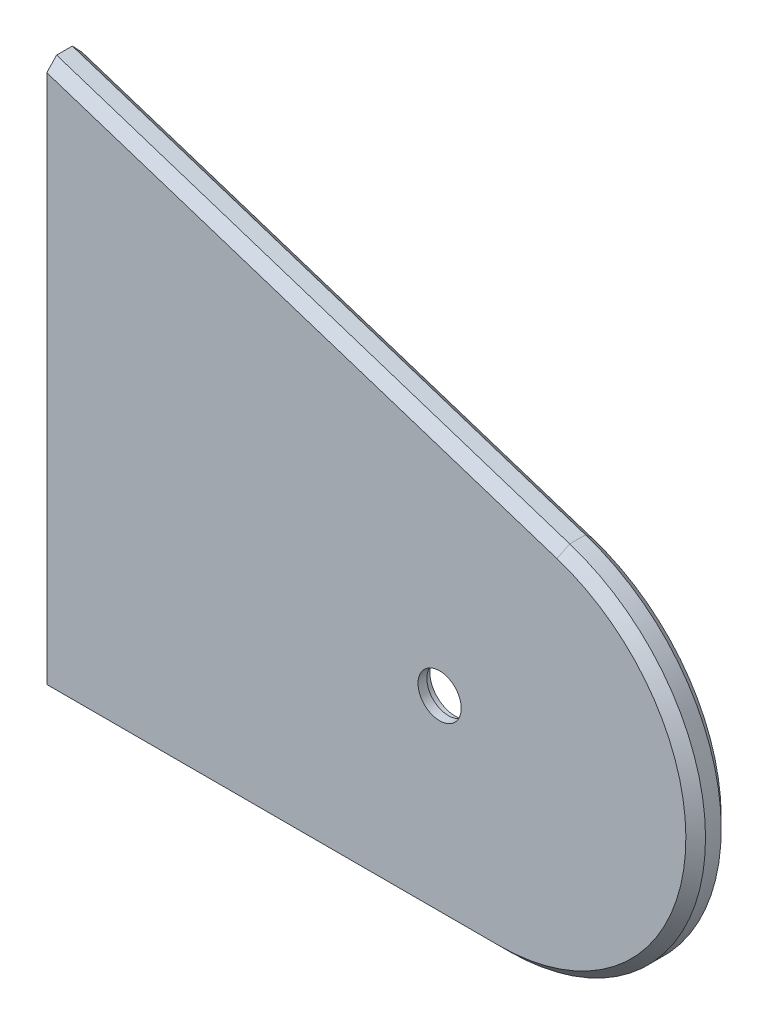
ISO-10303-21;
HEADER;
FILE_DESCRIPTION(('STEP AP214'),'2;1');
FILE_NAME('part.step','',(''),(''),'','','');
FILE_SCHEMA(('AUTOMOTIVE_DESIGN { 1 0 10303 214 1 1 1 1 }'));
ENDSEC;
DATA;
#1=APPLICATION_CONTEXT('core data for automotive mechanical design processes');
#2=APPLICATION_PROTOCOL_DEFINITION('international standard','automotive_design',2000,#1);
#3=PRODUCT_CONTEXT('',#1,'mechanical');
#4=PRODUCT('Part','Part','',(#3));
#5=PRODUCT_RELATED_PRODUCT_CATEGORY('part','',(#4));
#6=PRODUCT_DEFINITION_FORMATION('','',#4);
#7=PRODUCT_DEFINITION_CONTEXT('part definition',#1,'design');
#8=PRODUCT_DEFINITION('design','',#6,#7);
#9=PRODUCT_DEFINITION_SHAPE('','',#8);
#10=(LENGTH_UNIT() NAMED_UNIT(*) SI_UNIT(.MILLI.,.METRE.));
#11=(NAMED_UNIT(*) PLANE_ANGLE_UNIT() SI_UNIT($,.RADIAN.));
#12=(NAMED_UNIT(*) SI_UNIT($,.STERADIAN.) SOLID_ANGLE_UNIT());
#13=UNCERTAINTY_MEASURE_WITH_UNIT(LENGTH_MEASURE(1.E-05),#10,'distance_accuracy_value','');
#14=(GEOMETRIC_REPRESENTATION_CONTEXT(3) GLOBAL_UNCERTAINTY_ASSIGNED_CONTEXT((#13)) GLOBAL_UNIT_ASSIGNED_CONTEXT((#10,
#11,#12)) REPRESENTATION_CONTEXT('',''));
#15=CARTESIAN_POINT('',(0.,0.,0.));
#16=DIRECTION('',(0.,0.,1.));
#17=DIRECTION('',(1.,0.,0.));
#18=AXIS2_PLACEMENT_3D('',#15,#16,#17);
#19=CARTESIAN_POINT('',(200.,99.9999999999999,8.));
#20=DIRECTION('',(0.,0.,-1.));
#21=DIRECTION('',(-1.,0.,0.));
#22=AXIS2_PLACEMENT_3D('',#19,#20,#21);
#23=CYLINDRICAL_SURFACE('',#22,11.);
#24=CARTESIAN_POINT('',(200.,99.9999999999999,8.));
#25=DIRECTION('',(0.,0.,1.));
#26=DIRECTION('',(1.,0.,0.));
#27=AXIS2_PLACEMENT_3D('',#24,#25,#26);
#28=CIRCLE('',#27,11.);
#29=CARTESIAN_POINT('',(211.,99.9999999999999,8.));
#30=VERTEX_POINT('',#29);
#31=EDGE_CURVE('E212',#30,#30,#28,.T.);
#32=ORIENTED_EDGE('',*,*,#31,.T.);
#33=EDGE_LOOP('',(#32));
#34=FACE_BOUND('',#33,.T.);
#35=CARTESIAN_POINT('',(200.,99.9999999999999,3.5));
#36=DIRECTION('',(0.,0.,-1.));
#37=DIRECTION('',(-1.,0.,0.));
#38=AXIS2_PLACEMENT_3D('',#35,#36,#37);
#39=CIRCLE('',#38,11.);
#40=CARTESIAN_POINT('',(189.,99.9999999999999,3.5));
#41=VERTEX_POINT('',#40);
#42=EDGE_CURVE('E48',#41,#41,#39,.T.);
#43=ORIENTED_EDGE('',*,*,#42,.T.);
#44=EDGE_LOOP('',(#43));
#45=FACE_BOUND('',#44,.T.);
#46=ADVANCED_FACE('F43',(#34,#45),#23,.F.);
#47=CARTESIAN_POINT('',(0.,0.,0.));
#48=DIRECTION('',(0.,0.,-1.));
#49=DIRECTION('',(-1.,0.,0.));
#50=AXIS2_PLACEMENT_3D('',#47,#48,#49);
#51=PLANE('',#50);
#52=CARTESIAN_POINT('',(200.,99.9999999999999,0.));
#53=DIRECTION('',(0.,0.,-1.));
#54=DIRECTION('',(-1.,0.,0.));
#55=AXIS2_PLACEMENT_3D('',#52,#53,#54);
#56=CIRCLE('',#55,13.);
#57=CARTESIAN_POINT('',(187.,99.9999999999999,0.));
#58=VERTEX_POINT('',#57);
#59=EDGE_CURVE('E392',#58,#58,#56,.T.);
#60=ORIENTED_EDGE('',*,*,#59,.F.);
#61=EDGE_LOOP('',(#60));
#62=FACE_BOUND('',#61,.T.);
#63=DIRECTION('',(1.,0.,0.));
#64=VECTOR('',#63,1.);
#65=CARTESIAN_POINT('',(0.,10.,0.));
#66=LINE('',#65,#64);
#67=CARTESIAN_POINT('',(47.3205080756888,10.,0.));
#68=VERTEX_POINT('',#67);
#69=CARTESIAN_POINT('',(230.376238941563,10.,0.));
#70=VERTEX_POINT('',#69);
#71=EDGE_CURVE('E210',#68,#70,#66,.T.);
#72=ORIENTED_EDGE('',*,*,#71,.F.);
#73=CARTESIAN_POINT('',(47.3205080756888,20.,0.));
#74=DIRECTION('',(0.,0.,-1.));
#75=DIRECTION('',(-1.,0.,0.));
#76=AXIS2_PLACEMENT_3D('',#73,#74,#75);
#77=CIRCLE('',#76,10.);
#78=CARTESIAN_POINT('',(38.6602540378444,25.,0.));
#79=VERTEX_POINT('',#78);
#80=EDGE_CURVE('E255',#68,#79,#77,.T.);
#81=ORIENTED_EDGE('',*,*,#80,.T.);
#82=DIRECTION('',(0.499999999999998,0.86602540378444,0.));
#83=VECTOR('',#82,1.);
#84=CARTESIAN_POINT('',(18.1698729810779,-10.4903810567666,0.));
#85=LINE('',#84,#83);
#86=CARTESIAN_POINT('',(147.361565015534,213.276193462705,0.));
#87=VERTEX_POINT('',#86);
#88=EDGE_CURVE('E381',#79,#87,#85,.T.);
#89=ORIENTED_EDGE('',*,*,#88,.T.);
#90=CARTESIAN_POINT('',(156.021819053379,208.276193462705,0.));
#91=DIRECTION('',(0.,0.,-1.));
#92=DIRECTION('',(-1.,0.,0.));
#93=AXIS2_PLACEMENT_3D('',#90,#91,#92);
#94=CIRCLE('',#93,10.);
#95=CARTESIAN_POINT('',(159.111988997128,217.786758625656,0.));
#96=VERTEX_POINT('',#95);
#97=EDGE_CURVE('E253',#87,#96,#94,.T.);
#98=ORIENTED_EDGE('',*,*,#97,.T.);
#99=DIRECTION('',(0.951056516295152,-0.309016994374952,0.));
#100=VECTOR('',#99,1.);
#101=CARTESIAN_POINT('',(79.1997653771978,243.751814049541,0.));
#102=LINE('',#101,#100);
#103=CARTESIAN_POINT('',(258.187768435309,185.595086466564,0.));
#104=VERTEX_POINT('',#103);
#105=EDGE_CURVE('E380',#96,#104,#102,.T.);
#106=ORIENTED_EDGE('',*,*,#105,.T.);
#107=CARTESIAN_POINT('',(230.376238941563,100.,0.));
#108=DIRECTION('',(0.,0.,-1.));
#109=DIRECTION('',(-1.,0.,0.));
#110=AXIS2_PLACEMENT_3D('',#107,#108,#109);
#111=CIRCLE('',#110,90.);
#112=EDGE_CURVE('E378',#70,#104,#111,.F.);
#113=ORIENTED_EDGE('',*,*,#112,.F.);
#114=EDGE_LOOP('',(#72,#81,#89,#98,#106,#113));
#115=FACE_BOUND('',#114,.T.);
#116=ADVANCED_FACE('F413',(#62,#115),#51,.T.);
#117=CARTESIAN_POINT('',(0.,0.,8.));
#118=DIRECTION('',(0.,0.,-1.));
#119=DIRECTION('',(-1.,0.,0.));
#120=AXIS2_PLACEMENT_3D('',#117,#118,#119);
#121=PLANE('',#120);
#122=DIRECTION('',(0.,-1.,0.));
#123=VECTOR('',#122,1.);
#124=CARTESIAN_POINT('',(0.,0.,8.));
#125=LINE('',#124,#123);
#126=CARTESIAN_POINT('',(0.,274.742688878809,8.));
#127=VERTEX_POINT('',#126);
#128=CARTESIAN_POINT('',(0.,4.99999999999989,8.));
#129=VERTEX_POINT('',#128);
#130=EDGE_CURVE('E215',#127,#129,#125,.T.);
#131=ORIENTED_EDGE('',*,*,#130,.T.);
#132=DIRECTION('',(1.,0.,0.));
#133=VECTOR('',#132,1.);
#134=CARTESIAN_POINT('',(0.,4.99999999999989,8.));
#135=LINE('',#134,#133);
#136=CARTESIAN_POINT('',(230.376238941563,4.99999999999988,8.));
#137=VERTEX_POINT('',#136);
#138=EDGE_CURVE('E11',#129,#137,#135,.T.);
#139=ORIENTED_EDGE('',*,*,#138,.T.);
#140=CARTESIAN_POINT('',(230.376238941563,100.,8.));
#141=DIRECTION('',(0.,0.,-1.));
#142=DIRECTION('',(-1.,0.,0.));
#143=AXIS2_PLACEMENT_3D('',#140,#141,#142);
#144=CIRCLE('',#143,95.0000000000001);
#145=CARTESIAN_POINT('',(259.732853407183,190.35036904804,8.));
#146=VERTEX_POINT('',#145);
#147=EDGE_CURVE('E60',#137,#146,#144,.F.);
#148=ORIENTED_EDGE('',*,*,#147,.T.);
#149=DIRECTION('',(-0.951056516295152,0.309016994374951,0.));
#150=VECTOR('',#149,1.);
#151=CARTESIAN_POINT('',(80.7448503490725,248.507096631016,8.));
#152=LINE('',#151,#150);
#153=EDGE_CURVE('E53',#146,#127,#152,.T.);
#154=ORIENTED_EDGE('',*,*,#153,.T.);
#155=EDGE_LOOP('',(#131,#139,#148,#154));
#156=FACE_BOUND('',#155,.T.);
#157=ORIENTED_EDGE('',*,*,#31,.F.);
#158=EDGE_LOOP('',(#157));
#159=FACE_BOUND('',#158,.T.);
#160=ADVANCED_FACE('F323',(#156,#159),#121,.F.);
#161=CARTESIAN_POINT('',(861.751390409059,0.,8.));
#162=DIRECTION('',(0.,1.,0.));
#163=DIRECTION('',(-1.,0.,0.));
#164=AXIS2_PLACEMENT_3D('',#161,#162,#163);
#165=PLANE('',#164);
#166=DIRECTION('',(0.,0.,-1.));
#167=VECTOR('',#166,1.);
#168=CARTESIAN_POINT('',(0.,0.,8.));
#169=LINE('',#168,#167);
#170=CARTESIAN_POINT('',(0.,0.,3.00000000000015));
#171=VERTEX_POINT('',#170);
#172=CARTESIAN_POINT('',(0.,0.,-4.99999999999998));
#173=VERTEX_POINT('',#172);
#174=EDGE_CURVE('E223',#171,#173,#169,.T.);
#175=ORIENTED_EDGE('',*,*,#174,.T.);
#176=DIRECTION('',(1.,0.,0.));
#177=VECTOR('',#176,1.);
#178=CARTESIAN_POINT('',(230.376238941563,0.,-4.99999999999998));
#179=LINE('',#178,#177);
#180=CARTESIAN_POINT('',(230.376238941563,0.,-4.99999999999998));
#181=VERTEX_POINT('',#180);
#182=EDGE_CURVE('E299',#173,#181,#179,.T.);
#183=ORIENTED_EDGE('',*,*,#182,.T.);
#184=DIRECTION('',(0.,0.,-1.));
#185=VECTOR('',#184,1.);
#186=CARTESIAN_POINT('',(230.376238941563,0.,8.));
#187=LINE('',#186,#185);
#188=CARTESIAN_POINT('',(230.376238941563,0.,3.00000000000015));
#189=VERTEX_POINT('',#188);
#190=EDGE_CURVE('E232',#181,#189,#187,.F.);
#191=ORIENTED_EDGE('',*,*,#190,.T.);
#192=DIRECTION('',(-1.,0.,0.));
#193=VECTOR('',#192,1.);
#194=CARTESIAN_POINT('',(861.751390409059,0.,3.00000000000015));
#195=LINE('',#194,#193);
#196=EDGE_CURVE('E297',#189,#171,#195,.T.);
#197=ORIENTED_EDGE('',*,*,#196,.T.);
#198=EDGE_LOOP('',(#175,#183,#191,#197));
#199=FACE_BOUND('',#198,.T.);
#200=ADVANCED_FACE('F332',(#199),#165,.F.);
#201=CARTESIAN_POINT('',(0.,280.,8.));
#202=DIRECTION('',(-0.309016994374951,-0.951056516295152,0.));
#203=DIRECTION('',(0.951056516295152,-0.309016994374951,0.));
#204=AXIS2_PLACEMENT_3D('',#201,#202,#203);
#205=PLANE('',#204);
#206=DIRECTION('',(0.,0.,-1.));
#207=VECTOR('',#206,1.);
#208=CARTESIAN_POINT('',(261.277938379058,195.105651629515,8.));
#209=LINE('',#208,#207);
#210=CARTESIAN_POINT('',(261.277938379058,195.105651629515,3.00000000000015));
#211=VERTEX_POINT('',#210);
#212=CARTESIAN_POINT('',(261.277938379058,195.105651629515,-4.99999999999998));
#213=VERTEX_POINT('',#212);
#214=EDGE_CURVE('E229',#211,#213,#209,.T.);
#215=ORIENTED_EDGE('',*,*,#214,.T.);
#216=DIRECTION('',(-0.951056516295152,0.309016994374951,0.));
#217=VECTOR('',#216,1.);
#218=CARTESIAN_POINT('',(0.,280.,-4.99999999999999));
#219=LINE('',#218,#217);
#220=CARTESIAN_POINT('',(0.,280.,-4.99999999999999));
#221=VERTEX_POINT('',#220);
#222=EDGE_CURVE('E287',#213,#221,#219,.T.);
#223=ORIENTED_EDGE('',*,*,#222,.T.);
#224=DIRECTION('',(0.,0.,-1.));
#225=VECTOR('',#224,1.);
#226=CARTESIAN_POINT('',(0.,280.,8.));
#227=LINE('',#226,#225);
#228=CARTESIAN_POINT('',(0.,280.,3.00000000000015));
#229=VERTEX_POINT('',#228);
#230=EDGE_CURVE('E226',#229,#221,#227,.T.);
#231=ORIENTED_EDGE('',*,*,#230,.F.);
#232=DIRECTION('',(0.951056516295152,-0.309016994374951,0.));
#233=VECTOR('',#232,1.);
#234=CARTESIAN_POINT('',(0.,280.,3.00000000000015));
#235=LINE('',#234,#233);
#236=EDGE_CURVE('E285',#229,#211,#235,.T.);
#237=ORIENTED_EDGE('',*,*,#236,.T.);
#238=EDGE_LOOP('',(#215,#223,#231,#237));
#239=FACE_BOUND('',#238,.T.);
#240=ADVANCED_FACE('F354',(#239),#205,.F.);
#241=CARTESIAN_POINT('',(0.,0.,8.));
#242=DIRECTION('',(1.,0.,0.));
#243=DIRECTION('',(0.,0.,-1.));
#244=AXIS2_PLACEMENT_3D('',#241,#242,#243);
#245=PLANE('',#244);
#246=ORIENTED_EDGE('',*,*,#230,.T.);
#247=DIRECTION('',(0.,-0.724617040067446,-0.689151757774653));
#248=VECTOR('',#247,1.);
#249=CARTESIAN_POINT('',(0.,260.96717026782,-23.1012967403261));
#250=LINE('',#249,#248);
#251=CARTESIAN_POINT('',(0.,274.742688878809,-10.));
#252=VERTEX_POINT('',#251);
#253=EDGE_CURVE('E295',#221,#252,#250,.T.);
#254=ORIENTED_EDGE('',*,*,#253,.T.);
#255=DIRECTION('',(0.,1.,0.));
#256=VECTOR('',#255,1.);
#257=CARTESIAN_POINT('',(0.,0.,-10.));
#258=LINE('',#257,#256);
#259=CARTESIAN_POINT('',(0.,5.,-10.));
#260=VERTEX_POINT('',#259);
#261=EDGE_CURVE('E197',#260,#252,#258,.T.);
#262=ORIENTED_EDGE('',*,*,#261,.F.);
#263=DIRECTION('',(0.,-0.707106781186547,0.707106781186549));
#264=VECTOR('',#263,1.);
#265=CARTESIAN_POINT('',(0.,5.,-10.));
#266=LINE('',#265,#264);
#267=EDGE_CURVE('E293',#260,#173,#266,.T.);
#268=ORIENTED_EDGE('',*,*,#267,.T.);
#269=ORIENTED_EDGE('',*,*,#174,.F.);
#270=DIRECTION('',(0.,-0.70710678118655,-0.707106781186545));
#271=VECTOR('',#270,1.);
#272=CARTESIAN_POINT('',(0.,4.99999999999989,8.));
#273=LINE('',#272,#271);
#274=EDGE_CURVE('E291',#171,#129,#273,.F.);
#275=ORIENTED_EDGE('',*,*,#274,.T.);
#276=ORIENTED_EDGE('',*,*,#130,.F.);
#277=DIRECTION('',(0.,-0.724617040067449,0.689151757774649));
#278=VECTOR('',#277,1.);
#279=CARTESIAN_POINT('',(0.,260.96717026782,21.1012967403261));
#280=LINE('',#279,#278);
#281=EDGE_CURVE('E289',#127,#229,#280,.F.);
#282=ORIENTED_EDGE('',*,*,#281,.T.);
#283=EDGE_LOOP('',(#246,#254,#262,#268,#269,#275,#276,#282));
#284=FACE_BOUND('',#283,.T.);
#285=ADVANCED_FACE('F326',(#284),#245,.F.);
#286=CARTESIAN_POINT('',(230.376238941563,100.,8.));
#287=DIRECTION('',(0.,0.,-1.));
#288=DIRECTION('',(-1.,0.,0.));
#289=AXIS2_PLACEMENT_3D('',#286,#287,#288);
#290=CYLINDRICAL_SURFACE('',#289,100.);
#291=ORIENTED_EDGE('',*,*,#190,.F.);
#292=CARTESIAN_POINT('',(230.376238941563,100.,-4.99999999999998));
#293=DIRECTION('',(0.,0.,-1.));
#294=DIRECTION('',(-1.,0.,0.));
#295=AXIS2_PLACEMENT_3D('',#292,#293,#294);
#296=CIRCLE('',#295,100.);
#297=EDGE_CURVE('E303',#181,#213,#296,.F.);
#298=ORIENTED_EDGE('',*,*,#297,.T.);
#299=ORIENTED_EDGE('',*,*,#214,.F.);
#300=CARTESIAN_POINT('',(230.376238941563,100.,3.00000000000015));
#301=DIRECTION('',(0.,0.,-1.));
#302=DIRECTION('',(-1.,0.,0.));
#303=AXIS2_PLACEMENT_3D('',#300,#301,#302);
#304=CIRCLE('',#303,100.);
#305=EDGE_CURVE('E301',#211,#189,#304,.T.);
#306=ORIENTED_EDGE('',*,*,#305,.T.);
#307=EDGE_LOOP('',(#291,#298,#299,#306));
#308=FACE_BOUND('',#307,.T.);
#309=ADVANCED_FACE('F337',(#308),#290,.T.);
#310=CARTESIAN_POINT('',(0.,10.,-10.));
#311=DIRECTION('',(0.,-1.,0.));
#312=DIRECTION('',(1.,0.,0.));
#313=AXIS2_PLACEMENT_3D('',#310,#311,#312);
#314=PLANE('',#313);
#315=DIRECTION('',(1.,0.,0.));
#316=VECTOR('',#315,1.);
#317=CARTESIAN_POINT('',(0.,10.,-10.));
#318=LINE('',#317,#316);
#319=CARTESIAN_POINT('',(47.3205080756888,10.,-10.));
#320=VERTEX_POINT('',#319);
#321=CARTESIAN_POINT('',(230.376238941563,10.,-10.));
#322=VERTEX_POINT('',#321);
#323=EDGE_CURVE('E184',#320,#322,#318,.T.);
#324=ORIENTED_EDGE('',*,*,#323,.F.);
#325=DIRECTION('',(0.,0.,1.));
#326=VECTOR('',#325,1.);
#327=CARTESIAN_POINT('',(47.3205080756888,10.,-10.));
#328=LINE('',#327,#326);
#329=EDGE_CURVE('E251',#320,#68,#328,.T.);
#330=ORIENTED_EDGE('',*,*,#329,.T.);
#331=ORIENTED_EDGE('',*,*,#71,.T.);
#332=DIRECTION('',(0.,0.,1.));
#333=VECTOR('',#332,1.);
#334=CARTESIAN_POINT('',(230.376238941563,10.,-10.));
#335=LINE('',#334,#333);
#336=EDGE_CURVE('E203',#322,#70,#335,.T.);
#337=ORIENTED_EDGE('',*,*,#336,.F.);
#338=EDGE_LOOP('',(#324,#330,#331,#337));
#339=FACE_BOUND('',#338,.T.);
#340=ADVANCED_FACE('F208',(#339),#314,.F.);
#341=CARTESIAN_POINT('',(230.376238941563,100.,-10.));
#342=DIRECTION('',(0.,0.,1.));
#343=DIRECTION('',(1.,0.,0.));
#344=AXIS2_PLACEMENT_3D('',#341,#342,#343);
#345=CYLINDRICAL_SURFACE('',#344,90.);
#346=ORIENTED_EDGE('',*,*,#112,.T.);
#347=DIRECTION('',(0.,0.,1.));
#348=VECTOR('',#347,1.);
#349=CARTESIAN_POINT('',(258.187768435309,185.595086466564,-10.));
#350=LINE('',#349,#348);
#351=CARTESIAN_POINT('',(258.187768435309,185.595086466564,-10.));
#352=VERTEX_POINT('',#351);
#353=EDGE_CURVE('E205',#352,#104,#350,.T.);
#354=ORIENTED_EDGE('',*,*,#353,.F.);
#355=CARTESIAN_POINT('',(230.376238941563,100.,-10.));
#356=DIRECTION('',(0.,0.,-1.));
#357=DIRECTION('',(-1.,0.,0.));
#358=AXIS2_PLACEMENT_3D('',#355,#356,#357);
#359=CIRCLE('',#358,90.);
#360=EDGE_CURVE('E189',#322,#352,#359,.F.);
#361=ORIENTED_EDGE('',*,*,#360,.F.);
#362=ORIENTED_EDGE('',*,*,#336,.T.);
#363=EDGE_LOOP('',(#346,#354,#361,#362));
#364=FACE_BOUND('',#363,.T.);
#365=ADVANCED_FACE('F202',(#364),#345,.F.);
#366=CARTESIAN_POINT('',(79.1997653771978,243.751814049541,-10.));
#367=DIRECTION('',(-0.309016994374952,-0.951056516295152,0.));
#368=DIRECTION('',(0.951056516295152,-0.309016994374952,0.));
#369=AXIS2_PLACEMENT_3D('',#366,#367,#368);
#370=PLANE('',#369);
#371=ORIENTED_EDGE('',*,*,#105,.F.);
#372=DIRECTION('',(0.,0.,1.));
#373=VECTOR('',#372,1.);
#374=CARTESIAN_POINT('',(159.111988997128,217.786758625656,-10.));
#375=LINE('',#374,#373);
#376=CARTESIAN_POINT('',(159.111988997128,217.786758625656,-10.));
#377=VERTEX_POINT('',#376);
#378=EDGE_CURVE('E267',#96,#377,#375,.F.);
#379=ORIENTED_EDGE('',*,*,#378,.T.);
#380=DIRECTION('',(0.951056516295152,-0.309016994374952,0.));
#381=VECTOR('',#380,1.);
#382=CARTESIAN_POINT('',(79.1997653771978,243.751814049541,-10.));
#383=LINE('',#382,#381);
#384=EDGE_CURVE('E206',#377,#352,#383,.T.);
#385=ORIENTED_EDGE('',*,*,#384,.T.);
#386=ORIENTED_EDGE('',*,*,#353,.T.);
#387=EDGE_LOOP('',(#371,#379,#385,#386));
#388=FACE_BOUND('',#387,.T.);
#389=ADVANCED_FACE('F559',(#388),#370,.T.);
#390=CARTESIAN_POINT('',(10.,0.,-10.));
#391=DIRECTION('',(-1.,0.,0.));
#392=DIRECTION('',(0.,-1.,0.));
#393=AXIS2_PLACEMENT_3D('',#390,#391,#392);
#394=PLANE('',#393);
#395=DIRECTION('',(0.,-1.,0.));
#396=VECTOR('',#395,1.);
#397=CARTESIAN_POINT('',(10.,0.,0.));
#398=LINE('',#397,#396);
#399=CARTESIAN_POINT('',(10.,252.472361590576,0.));
#400=VERTEX_POINT('',#399);
#401=CARTESIAN_POINT('',(10.,72.6794919243115,0.));
#402=VERTEX_POINT('',#401);
#403=EDGE_CURVE('E313',#400,#402,#398,.T.);
#404=ORIENTED_EDGE('',*,*,#403,.T.);
#405=DIRECTION('',(0.,0.,1.));
#406=VECTOR('',#405,1.);
#407=CARTESIAN_POINT('',(10.,72.6794919243115,-10.));
#408=LINE('',#407,#406);
#409=CARTESIAN_POINT('',(10.,72.6794919243115,-10.));
#410=VERTEX_POINT('',#409);
#411=EDGE_CURVE('E249',#402,#410,#408,.F.);
#412=ORIENTED_EDGE('',*,*,#411,.T.);
#413=DIRECTION('',(0.,-1.,0.));
#414=VECTOR('',#413,1.);
#415=CARTESIAN_POINT('',(10.,0.,-10.));
#416=LINE('',#415,#414);
#417=CARTESIAN_POINT('',(10.,252.472361590576,-10.));
#418=VERTEX_POINT('',#417);
#419=EDGE_CURVE('E383',#418,#410,#416,.T.);
#420=ORIENTED_EDGE('',*,*,#419,.F.);
#421=DIRECTION('',(0.,0.,1.));
#422=VECTOR('',#421,1.);
#423=CARTESIAN_POINT('',(10.,252.472361590576,-10.));
#424=LINE('',#423,#422);
#425=EDGE_CURVE('E246',#418,#400,#424,.T.);
#426=ORIENTED_EDGE('',*,*,#425,.T.);
#427=EDGE_LOOP('',(#404,#412,#420,#426));
#428=FACE_BOUND('',#427,.T.);
#429=ADVANCED_FACE('F424',(#428),#394,.F.);
#430=CARTESIAN_POINT('',(-7.81088913245529,4.50961894323335,-10.));
#431=DIRECTION('',(0.86602540378444,-0.499999999999998,0.));
#432=DIRECTION('',(0.499999999999998,0.86602540378444,0.));
#433=AXIS2_PLACEMENT_3D('',#430,#431,#432);
#434=PLANE('',#433);
#435=DIRECTION('',(0.499999999999998,0.86602540378444,0.));
#436=VECTOR('',#435,1.);
#437=CARTESIAN_POINT('',(-7.81088913245529,4.50961894323335,-10.));
#438=LINE('',#437,#436);
#439=CARTESIAN_POINT('',(28.6602540378444,67.6794919243115,-10.));
#440=VERTEX_POINT('',#439);
#441=CARTESIAN_POINT('',(116.066888860251,219.072224355339,-10.));
#442=VERTEX_POINT('',#441);
#443=EDGE_CURVE('E362',#440,#442,#438,.T.);
#444=ORIENTED_EDGE('',*,*,#443,.F.);
#445=DIRECTION('',(0.,0.,1.));
#446=VECTOR('',#445,1.);
#447=CARTESIAN_POINT('',(28.6602540378444,67.6794919243115,0.));
#448=LINE('',#447,#446);
#449=CARTESIAN_POINT('',(28.6602540378444,67.6794919243115,0.));
#450=VERTEX_POINT('',#449);
#451=EDGE_CURVE('E237',#440,#450,#448,.T.);
#452=ORIENTED_EDGE('',*,*,#451,.T.);
#453=DIRECTION('',(0.499999999999998,0.86602540378444,0.));
#454=VECTOR('',#453,1.);
#455=CARTESIAN_POINT('',(-7.81088913245529,4.50961894323335,0.));
#456=LINE('',#455,#454);
#457=CARTESIAN_POINT('',(116.066888860251,219.072224355339,0.));
#458=VERTEX_POINT('',#457);
#459=EDGE_CURVE('E371',#450,#458,#456,.T.);
#460=ORIENTED_EDGE('',*,*,#459,.T.);
#461=DIRECTION('',(0.,0.,1.));
#462=VECTOR('',#461,1.);
#463=CARTESIAN_POINT('',(116.066888860251,219.072224355339,-10.));
#464=LINE('',#463,#462);
#465=EDGE_CURVE('E235',#458,#442,#464,.F.);
#466=ORIENTED_EDGE('',*,*,#465,.T.);
#467=EDGE_LOOP('',(#444,#452,#460,#466));
#468=FACE_BOUND('',#467,.T.);
#469=ADVANCED_FACE('F545',(#468),#434,.F.);
#470=CARTESIAN_POINT('',(79.1997653771976,243.75181404954,-10.));
#471=DIRECTION('',(-0.309016994374951,-0.951056516295152,0.));
#472=DIRECTION('',(0.951056516295152,-0.309016994374951,0.));
#473=AXIS2_PLACEMENT_3D('',#470,#471,#472);
#474=PLANE('',#473);
#475=DIRECTION('',(0.951056516295152,-0.309016994374951,0.));
#476=VECTOR('',#475,1.);
#477=CARTESIAN_POINT('',(79.1997653771976,243.75181404954,-10.));
#478=LINE('',#477,#476);
#479=CARTESIAN_POINT('',(23.0901699437495,261.982926753528,-10.));
#480=VERTEX_POINT('',#479);
#481=CARTESIAN_POINT('',(110.496804766156,233.582789518291,-10.));
#482=VERTEX_POINT('',#481);
#483=EDGE_CURVE('E359',#480,#482,#478,.T.);
#484=ORIENTED_EDGE('',*,*,#483,.T.);
#485=DIRECTION('',(0.,0.,1.));
#486=VECTOR('',#485,1.);
#487=CARTESIAN_POINT('',(110.496804766156,233.582789518291,-10.));
#488=LINE('',#487,#486);
#489=CARTESIAN_POINT('',(110.496804766156,233.582789518291,0.));
#490=VERTEX_POINT('',#489);
#491=EDGE_CURVE('E264',#482,#490,#488,.T.);
#492=ORIENTED_EDGE('',*,*,#491,.T.);
#493=DIRECTION('',(0.951056516295152,-0.309016994374951,0.));
#494=VECTOR('',#493,1.);
#495=CARTESIAN_POINT('',(79.1997653771976,243.75181404954,0.));
#496=LINE('',#495,#494);
#497=CARTESIAN_POINT('',(23.0901699437495,261.982926753528,0.));
#498=VERTEX_POINT('',#497);
#499=EDGE_CURVE('E374',#498,#490,#496,.T.);
#500=ORIENTED_EDGE('',*,*,#499,.F.);
#501=DIRECTION('',(0.,0.,1.));
#502=VECTOR('',#501,1.);
#503=CARTESIAN_POINT('',(23.0901699437495,261.982926753528,-10.));
#504=LINE('',#503,#502);
#505=EDGE_CURVE('E262',#498,#480,#504,.F.);
#506=ORIENTED_EDGE('',*,*,#505,.T.);
#507=EDGE_LOOP('',(#484,#492,#500,#506));
#508=FACE_BOUND('',#507,.T.);
#509=ADVANCED_FACE('F537',(#508),#474,.T.);
#510=CARTESIAN_POINT('',(18.1698729810779,-10.4903810567666,-10.));
#511=DIRECTION('',(0.86602540378444,-0.499999999999998,0.));
#512=DIRECTION('',(0.499999999999998,0.86602540378444,0.));
#513=AXIS2_PLACEMENT_3D('',#510,#511,#512);
#514=PLANE('',#513);
#515=ORIENTED_EDGE('',*,*,#88,.F.);
#516=DIRECTION('',(0.,0.,1.));
#517=VECTOR('',#516,1.);
#518=CARTESIAN_POINT('',(38.6602540378444,25.,-10.));
#519=LINE('',#518,#517);
#520=CARTESIAN_POINT('',(38.6602540378444,25.,-10.));
#521=VERTEX_POINT('',#520);
#522=EDGE_CURVE('E260',#79,#521,#519,.F.);
#523=ORIENTED_EDGE('',*,*,#522,.T.);
#524=DIRECTION('',(0.499999999999998,0.86602540378444,0.));
#525=VECTOR('',#524,1.);
#526=CARTESIAN_POINT('',(18.1698729810779,-10.4903810567666,-10.));
#527=LINE('',#526,#525);
#528=CARTESIAN_POINT('',(147.361565015534,213.276193462705,-10.));
#529=VERTEX_POINT('',#528);
#530=EDGE_CURVE('E217',#521,#529,#527,.T.);
#531=ORIENTED_EDGE('',*,*,#530,.T.);
#532=DIRECTION('',(0.,0.,1.));
#533=VECTOR('',#532,1.);
#534=CARTESIAN_POINT('',(147.361565015534,213.276193462705,0.));
#535=LINE('',#534,#533);
#536=EDGE_CURVE('E257',#529,#87,#535,.T.);
#537=ORIENTED_EDGE('',*,*,#536,.T.);
#538=EDGE_LOOP('',(#515,#523,#531,#537));
#539=FACE_BOUND('',#538,.T.);
#540=ADVANCED_FACE('F530',(#539),#514,.T.);
#541=CARTESIAN_POINT('',(0.,0.,-10.));
#542=DIRECTION('',(0.,0.,-1.));
#543=DIRECTION('',(-1.,0.,0.));
#544=AXIS2_PLACEMENT_3D('',#541,#542,#543);
#545=PLANE('',#544);
#546=ORIENTED_EDGE('',*,*,#261,.T.);
#547=DIRECTION('',(0.951056516295152,-0.309016994374951,0.));
#548=VECTOR('',#547,1.);
#549=CARTESIAN_POINT('',(259.732853407183,190.350369048039,-10.));
#550=LINE('',#549,#548);
#551=CARTESIAN_POINT('',(259.732853407183,190.350369048039,-10.));
#552=VERTEX_POINT('',#551);
#553=EDGE_CURVE('E282',#252,#552,#550,.T.);
#554=ORIENTED_EDGE('',*,*,#553,.T.);
#555=CARTESIAN_POINT('',(230.376238941563,100.,-10.));
#556=DIRECTION('',(0.,0.,-1.));
#557=DIRECTION('',(-1.,0.,0.));
#558=AXIS2_PLACEMENT_3D('',#555,#556,#557);
#559=CIRCLE('',#558,95.);
#560=CARTESIAN_POINT('',(230.376238941563,5.,-10.));
#561=VERTEX_POINT('',#560);
#562=EDGE_CURVE('E278',#552,#561,#559,.T.);
#563=ORIENTED_EDGE('',*,*,#562,.T.);
#564=DIRECTION('',(-1.,0.,0.));
#565=VECTOR('',#564,1.);
#566=CARTESIAN_POINT('',(0.,5.,-10.));
#567=LINE('',#566,#565);
#568=EDGE_CURVE('E280',#561,#260,#567,.T.);
#569=ORIENTED_EDGE('',*,*,#568,.T.);
#570=EDGE_LOOP('',(#546,#554,#563,#569));
#571=FACE_BOUND('',#570,.T.);
#572=ORIENTED_EDGE('',*,*,#483,.F.);
#573=CARTESIAN_POINT('',(20.,252.472361590576,-10.));
#574=DIRECTION('',(0.,0.,-1.));
#575=DIRECTION('',(-1.,0.,0.));
#576=AXIS2_PLACEMENT_3D('',#573,#574,#575);
#577=CIRCLE('',#576,10.);
#578=EDGE_CURVE('E276',#480,#418,#577,.F.);
#579=ORIENTED_EDGE('',*,*,#578,.T.);
#580=ORIENTED_EDGE('',*,*,#419,.T.);
#581=CARTESIAN_POINT('',(20.,72.6794919243115,-10.));
#582=DIRECTION('',(0.,0.,-1.));
#583=DIRECTION('',(-1.,0.,0.));
#584=AXIS2_PLACEMENT_3D('',#581,#582,#583);
#585=CIRCLE('',#584,10.);
#586=EDGE_CURVE('E269',#410,#440,#585,.F.);
#587=ORIENTED_EDGE('',*,*,#586,.T.);
#588=ORIENTED_EDGE('',*,*,#443,.T.);
#589=CARTESIAN_POINT('',(107.406634822406,224.072224355339,-10.));
#590=DIRECTION('',(0.,0.,-1.));
#591=DIRECTION('',(-1.,0.,0.));
#592=AXIS2_PLACEMENT_3D('',#589,#590,#591);
#593=CIRCLE('',#592,10.);
#594=EDGE_CURVE('E272',#442,#482,#593,.F.);
#595=ORIENTED_EDGE('',*,*,#594,.T.);
#596=EDGE_LOOP('',(#572,#579,#580,#587,#588,#595));
#597=FACE_BOUND('',#596,.T.);
#598=ORIENTED_EDGE('',*,*,#530,.F.);
#599=CARTESIAN_POINT('',(47.3205080756888,20.,-10.));
#600=DIRECTION('',(0.,0.,-1.));
#601=DIRECTION('',(-1.,0.,0.));
#602=AXIS2_PLACEMENT_3D('',#599,#600,#601);
#603=CIRCLE('',#602,10.);
#604=EDGE_CURVE('E192',#521,#320,#603,.F.);
#605=ORIENTED_EDGE('',*,*,#604,.T.);
#606=ORIENTED_EDGE('',*,*,#323,.T.);
#607=ORIENTED_EDGE('',*,*,#360,.T.);
#608=ORIENTED_EDGE('',*,*,#384,.F.);
#609=CARTESIAN_POINT('',(156.021819053379,208.276193462705,-10.));
#610=DIRECTION('',(0.,0.,-1.));
#611=DIRECTION('',(-1.,0.,0.));
#612=AXIS2_PLACEMENT_3D('',#609,#610,#611);
#613=CIRCLE('',#612,10.);
#614=EDGE_CURVE('E274',#377,#529,#613,.F.);
#615=ORIENTED_EDGE('',*,*,#614,.T.);
#616=EDGE_LOOP('',(#598,#605,#606,#607,#608,#615));
#617=FACE_BOUND('',#616,.T.);
#618=ADVANCED_FACE('F187',(#571,#597,#617),#545,.T.);
#619=ORIENTED_EDGE('',*,*,#459,.F.);
#620=CARTESIAN_POINT('',(20.,72.6794919243115,0.));
#621=DIRECTION('',(0.,0.,-1.));
#622=DIRECTION('',(-1.,0.,0.));
#623=AXIS2_PLACEMENT_3D('',#620,#621,#622);
#624=CIRCLE('',#623,10.);
#625=EDGE_CURVE('E244',#450,#402,#624,.T.);
#626=ORIENTED_EDGE('',*,*,#625,.T.);
#627=ORIENTED_EDGE('',*,*,#403,.F.);
#628=CARTESIAN_POINT('',(20.,252.472361590576,0.));
#629=DIRECTION('',(0.,0.,-1.));
#630=DIRECTION('',(-1.,0.,0.));
#631=AXIS2_PLACEMENT_3D('',#628,#629,#630);
#632=CIRCLE('',#631,10.);
#633=EDGE_CURVE('E240',#400,#498,#632,.T.);
#634=ORIENTED_EDGE('',*,*,#633,.T.);
#635=ORIENTED_EDGE('',*,*,#499,.T.);
#636=CARTESIAN_POINT('',(107.406634822406,224.072224355339,0.));
#637=DIRECTION('',(0.,0.,-1.));
#638=DIRECTION('',(-1.,0.,0.));
#639=AXIS2_PLACEMENT_3D('',#636,#637,#638);
#640=CIRCLE('',#639,10.);
#641=EDGE_CURVE('E242',#490,#458,#640,.T.);
#642=ORIENTED_EDGE('',*,*,#641,.T.);
#643=EDGE_LOOP('',(#619,#626,#627,#634,#635,#642));
#644=FACE_BOUND('',#643,.T.);
#645=ADVANCED_FACE('F421',(#644),#51,.T.);
#646=CARTESIAN_POINT('',(20.,72.6794919243115,-10.));
#647=DIRECTION('',(0.,0.,-1.));
#648=DIRECTION('',(-1.,0.,0.));
#649=AXIS2_PLACEMENT_3D('',#646,#647,#648);
#650=CYLINDRICAL_SURFACE('',#649,10.);
#651=ORIENTED_EDGE('',*,*,#586,.F.);
#652=ORIENTED_EDGE('',*,*,#411,.F.);
#653=ORIENTED_EDGE('',*,*,#625,.F.);
#654=ORIENTED_EDGE('',*,*,#451,.F.);
#655=EDGE_LOOP('',(#651,#652,#653,#654));
#656=FACE_BOUND('',#655,.T.);
#657=ADVANCED_FACE('F429',(#656),#650,.F.);
#658=CARTESIAN_POINT('',(47.3205080756888,20.,-10.));
#659=DIRECTION('',(0.,0.,1.));
#660=DIRECTION('',(1.,0.,0.));
#661=AXIS2_PLACEMENT_3D('',#658,#659,#660);
#662=CYLINDRICAL_SURFACE('',#661,10.);
#663=ORIENTED_EDGE('',*,*,#604,.F.);
#664=ORIENTED_EDGE('',*,*,#522,.F.);
#665=ORIENTED_EDGE('',*,*,#80,.F.);
#666=ORIENTED_EDGE('',*,*,#329,.F.);
#667=EDGE_LOOP('',(#663,#664,#665,#666));
#668=FACE_BOUND('',#667,.T.);
#669=ADVANCED_FACE('F441',(#668),#662,.F.);
#670=CARTESIAN_POINT('',(107.406634822406,224.072224355339,-10.));
#671=DIRECTION('',(0.,0.,1.));
#672=DIRECTION('',(1.,0.,0.));
#673=AXIS2_PLACEMENT_3D('',#670,#671,#672);
#674=CYLINDRICAL_SURFACE('',#673,10.);
#675=ORIENTED_EDGE('',*,*,#594,.F.);
#676=ORIENTED_EDGE('',*,*,#465,.F.);
#677=ORIENTED_EDGE('',*,*,#641,.F.);
#678=ORIENTED_EDGE('',*,*,#491,.F.);
#679=EDGE_LOOP('',(#675,#676,#677,#678));
#680=FACE_BOUND('',#679,.T.);
#681=ADVANCED_FACE('F445',(#680),#674,.F.);
#682=CARTESIAN_POINT('',(156.021819053379,208.276193462705,-10.));
#683=DIRECTION('',(0.,0.,-1.));
#684=DIRECTION('',(-1.,0.,0.));
#685=AXIS2_PLACEMENT_3D('',#682,#683,#684);
#686=CYLINDRICAL_SURFACE('',#685,10.);
#687=ORIENTED_EDGE('',*,*,#614,.F.);
#688=ORIENTED_EDGE('',*,*,#378,.F.);
#689=ORIENTED_EDGE('',*,*,#97,.F.);
#690=ORIENTED_EDGE('',*,*,#536,.F.);
#691=EDGE_LOOP('',(#687,#688,#689,#690));
#692=FACE_BOUND('',#691,.T.);
#693=ADVANCED_FACE('F449',(#692),#686,.F.);
#694=CARTESIAN_POINT('',(20.,252.472361590576,-10.));
#695=DIRECTION('',(0.,0.,1.));
#696=DIRECTION('',(1.,0.,0.));
#697=AXIS2_PLACEMENT_3D('',#694,#695,#696);
#698=CYLINDRICAL_SURFACE('',#697,10.);
#699=ORIENTED_EDGE('',*,*,#578,.F.);
#700=ORIENTED_EDGE('',*,*,#505,.F.);
#701=ORIENTED_EDGE('',*,*,#633,.F.);
#702=ORIENTED_EDGE('',*,*,#425,.F.);
#703=EDGE_LOOP('',(#699,#700,#701,#702));
#704=FACE_BOUND('',#703,.T.);
#705=ADVANCED_FACE('F453',(#704),#698,.F.);
#706=CARTESIAN_POINT('',(0.,5.,-10.));
#707=DIRECTION('',(0.,-0.707106781186549,-0.707106781186547));
#708=DIRECTION('',(1.,0.,0.));
#709=AXIS2_PLACEMENT_3D('',#706,#707,#708);
#710=PLANE('',#709);
#711=ORIENTED_EDGE('',*,*,#267,.F.);
#712=ORIENTED_EDGE('',*,*,#568,.F.);
#713=DIRECTION('',(0.,0.707106781186547,-0.707106781186549));
#714=VECTOR('',#713,1.);
#715=CARTESIAN_POINT('',(230.376238941563,0.,-4.99999999999998));
#716=LINE('',#715,#714);
#717=EDGE_CURVE('E309',#181,#561,#716,.T.);
#718=ORIENTED_EDGE('',*,*,#717,.F.);
#719=ORIENTED_EDGE('',*,*,#182,.F.);
#720=EDGE_LOOP('',(#711,#712,#718,#719));
#721=FACE_BOUND('',#720,.T.);
#722=ADVANCED_FACE('F343',(#721),#710,.T.);
#723=CARTESIAN_POINT('',(230.376238941563,100.,-10.));
#724=DIRECTION('',(0.,0.,1.));
#725=DIRECTION('',(1.,0.,0.));
#726=AXIS2_PLACEMENT_3D('',#723,#724,#725);
#727=CONICAL_SURFACE('',#726,95.,0.785398163397447);
#728=ORIENTED_EDGE('',*,*,#717,.T.);
#729=ORIENTED_EDGE('',*,*,#562,.F.);
#730=DIRECTION('',(-0.218508012224416,-0.672498511963954,-0.707106781186549));
#731=VECTOR('',#730,1.);
#732=CARTESIAN_POINT('',(261.277938379058,195.105651629515,-4.99999999999998));
#733=LINE('',#732,#731);
#734=EDGE_CURVE('E307',#213,#552,#733,.T.);
#735=ORIENTED_EDGE('',*,*,#734,.F.);
#736=ORIENTED_EDGE('',*,*,#297,.F.);
#737=EDGE_LOOP('',(#728,#729,#735,#736));
#738=FACE_BOUND('',#737,.T.);
#739=ADVANCED_FACE('F347',(#738),#727,.T.);
#740=CARTESIAN_POINT('',(80.7448503490724,248.507096631016,-10.));
#741=DIRECTION('',(0.218508012224414,0.672498511963958,-0.707106781186546));
#742=DIRECTION('',(-0.951056516295152,0.309016994374951,0.));
#743=AXIS2_PLACEMENT_3D('',#740,#741,#742);
#744=PLANE('',#743);
#745=ORIENTED_EDGE('',*,*,#253,.F.);
#746=ORIENTED_EDGE('',*,*,#222,.F.);
#747=ORIENTED_EDGE('',*,*,#734,.T.);
#748=ORIENTED_EDGE('',*,*,#553,.F.);
#749=EDGE_LOOP('',(#745,#746,#747,#748));
#750=FACE_BOUND('',#749,.T.);
#751=ADVANCED_FACE('F352',(#750),#744,.T.);
#752=CARTESIAN_POINT('',(80.7448503490725,248.507096631016,8.));
#753=DIRECTION('',(-0.218508012224413,-0.672498511963955,-0.707106781186549));
#754=DIRECTION('',(-0.951056516295152,0.309016994374951,0.));
#755=AXIS2_PLACEMENT_3D('',#752,#753,#754);
#756=PLANE('',#755);
#757=ORIENTED_EDGE('',*,*,#281,.F.);
#758=ORIENTED_EDGE('',*,*,#153,.F.);
#759=DIRECTION('',(-0.218508012224414,-0.67249851196396,0.707106781186544));
#760=VECTOR('',#759,1.);
#761=CARTESIAN_POINT('',(261.277938379058,195.105651629515,3.00000000000015));
#762=LINE('',#761,#760);
#763=EDGE_CURVE('E310',#211,#146,#762,.T.);
#764=ORIENTED_EDGE('',*,*,#763,.F.);
#765=ORIENTED_EDGE('',*,*,#236,.F.);
#766=EDGE_LOOP('',(#757,#758,#764,#765));
#767=FACE_BOUND('',#766,.T.);
#768=ADVANCED_FACE('F46',(#767),#756,.F.);
#769=CARTESIAN_POINT('',(230.376238941563,100.,8.));
#770=DIRECTION('',(0.,0.,-1.));
#771=DIRECTION('',(-1.,0.,0.));
#772=AXIS2_PLACEMENT_3D('',#769,#770,#771);
#773=CONICAL_SURFACE('',#772,95.0000000000001,0.785398163397451);
#774=ORIENTED_EDGE('',*,*,#763,.T.);
#775=ORIENTED_EDGE('',*,*,#147,.F.);
#776=DIRECTION('',(0.,0.707106781186549,0.707106781186546));
#777=VECTOR('',#776,1.);
#778=CARTESIAN_POINT('',(230.376238941563,0.,3.00000000000015));
#779=LINE('',#778,#777);
#780=EDGE_CURVE('E68',#189,#137,#779,.T.);
#781=ORIENTED_EDGE('',*,*,#780,.F.);
#782=ORIENTED_EDGE('',*,*,#305,.F.);
#783=EDGE_LOOP('',(#774,#775,#781,#782));
#784=FACE_BOUND('',#783,.T.);
#785=ADVANCED_FACE('F318',(#784),#773,.T.);
#786=CARTESIAN_POINT('',(0.,4.99999999999989,8.));
#787=DIRECTION('',(0.,0.707106781186545,-0.70710678118655));
#788=DIRECTION('',(1.,0.,0.));
#789=AXIS2_PLACEMENT_3D('',#786,#787,#788);
#790=PLANE('',#789);
#791=ORIENTED_EDGE('',*,*,#274,.F.);
#792=ORIENTED_EDGE('',*,*,#196,.F.);
#793=ORIENTED_EDGE('',*,*,#780,.T.);
#794=ORIENTED_EDGE('',*,*,#138,.F.);
#795=EDGE_LOOP('',(#791,#792,#793,#794));
#796=FACE_BOUND('',#795,.T.);
#797=ADVANCED_FACE('F330',(#796),#790,.F.);
#798=CARTESIAN_POINT('',(200.,99.9999999999999,3.5));
#799=DIRECTION('',(0.,0.,-1.));
#800=DIRECTION('',(-1.,0.,0.));
#801=AXIS2_PLACEMENT_3D('',#798,#799,#800);
#802=CYLINDRICAL_SURFACE('',#801,13.);
#803=CARTESIAN_POINT('',(200.,99.9999999999999,3.5));
#804=DIRECTION('',(0.,0.,-1.));
#805=DIRECTION('',(-1.,0.,0.));
#806=AXIS2_PLACEMENT_3D('',#803,#804,#805);
#807=CIRCLE('',#806,13.);
#808=CARTESIAN_POINT('',(187.,99.9999999999999,3.5));
#809=VERTEX_POINT('',#808);
#810=EDGE_CURVE('E395',#809,#809,#807,.T.);
#811=ORIENTED_EDGE('',*,*,#810,.F.);
#812=EDGE_LOOP('',(#811));
#813=FACE_BOUND('',#812,.T.);
#814=ORIENTED_EDGE('',*,*,#59,.T.);
#815=EDGE_LOOP('',(#814));
#816=FACE_BOUND('',#815,.T.);
#817=ADVANCED_FACE('F405',(#813,#816),#802,.F.);
#818=CARTESIAN_POINT('',(200.,99.9999999999999,3.5));
#819=DIRECTION('',(0.,0.,-1.));
#820=DIRECTION('',(-1.,0.,0.));
#821=AXIS2_PLACEMENT_3D('',#818,#819,#820);
#822=PLANE('',#821);
#823=ORIENTED_EDGE('',*,*,#42,.F.);
#824=EDGE_LOOP('',(#823));
#825=FACE_BOUND('',#824,.T.);
#826=ORIENTED_EDGE('',*,*,#810,.T.);
#827=EDGE_LOOP('',(#826));
#828=FACE_BOUND('',#827,.T.);
#829=ADVANCED_FACE('F403',(#825,#828),#822,.T.);
#830=CLOSED_SHELL('',(#46,#116,#160,#200,#240,#285,#309,#340,#365,#389,#429,#469,#509,#540,#618,
#645,#657,#669,#681,#693,#705,#722,#739,#751,#768,#785,#797,#817,#829));
#831=MANIFOLD_SOLID_BREP('B2',#830);
#832=ADVANCED_BREP_SHAPE_REPRESENTATION('',(#18,#831),#14);
#833=SHAPE_DEFINITION_REPRESENTATION(#9,#832);
ENDSEC;
END-ISO-10303-21;
